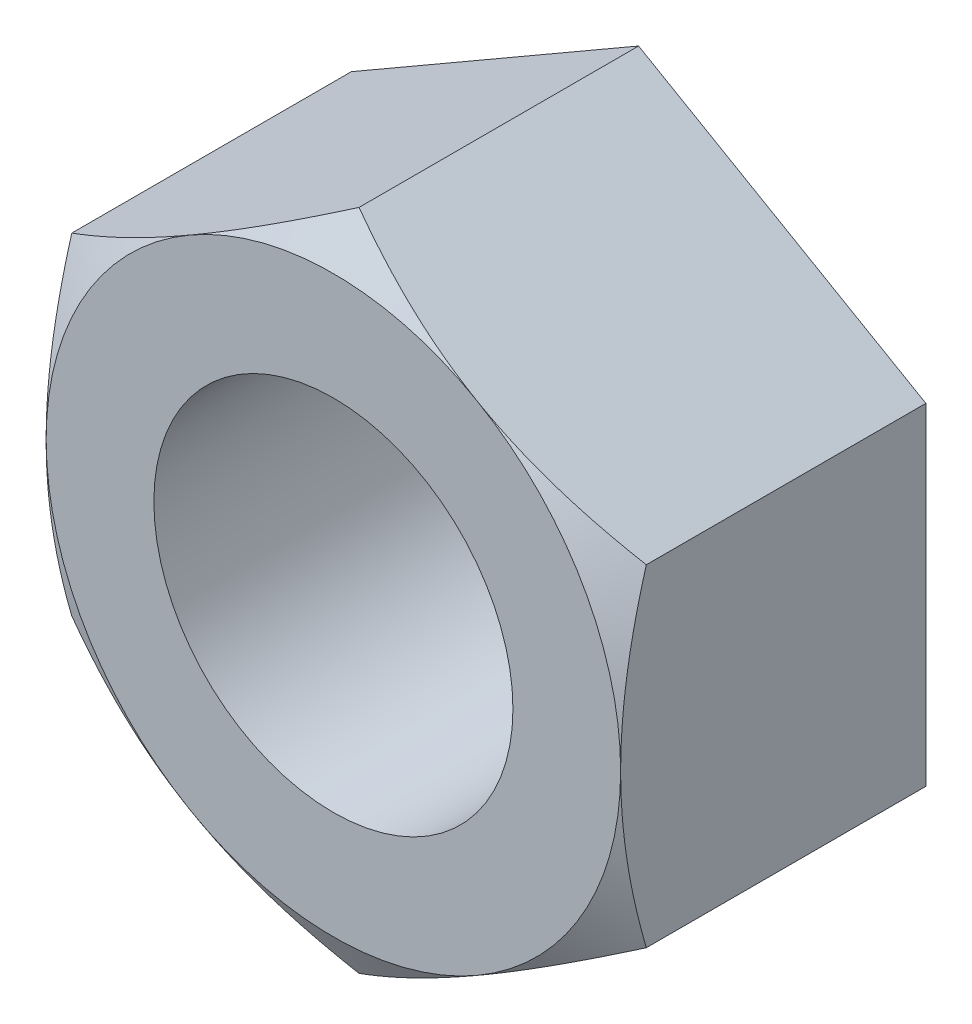
ISO-10303-21;
HEADER;
FILE_DESCRIPTION(('STEP AP214'),'2;1');
FILE_NAME('part.step','',(''),(''),'','','');
FILE_SCHEMA(('AUTOMOTIVE_DESIGN { 1 0 10303 214 1 1 1 1 }'));
ENDSEC;
DATA;
#1=APPLICATION_CONTEXT('core data for automotive mechanical design processes');
#2=APPLICATION_PROTOCOL_DEFINITION('international standard','automotive_design',2000,#1);
#3=PRODUCT_CONTEXT('',#1,'mechanical');
#4=PRODUCT('Part','Part','',(#3));
#5=PRODUCT_RELATED_PRODUCT_CATEGORY('part','',(#4));
#6=PRODUCT_DEFINITION_FORMATION('','',#4);
#7=PRODUCT_DEFINITION_CONTEXT('part definition',#1,'design');
#8=PRODUCT_DEFINITION('design','',#6,#7);
#9=PRODUCT_DEFINITION_SHAPE('','',#8);
#10=(LENGTH_UNIT() NAMED_UNIT(*) SI_UNIT(.MILLI.,.METRE.));
#11=(NAMED_UNIT(*) PLANE_ANGLE_UNIT() SI_UNIT($,.RADIAN.));
#12=(NAMED_UNIT(*) SI_UNIT($,.STERADIAN.) SOLID_ANGLE_UNIT());
#13=UNCERTAINTY_MEASURE_WITH_UNIT(LENGTH_MEASURE(1.E-05),#10,'distance_accuracy_value','');
#14=(GEOMETRIC_REPRESENTATION_CONTEXT(3) GLOBAL_UNCERTAINTY_ASSIGNED_CONTEXT((#13)) GLOBAL_UNIT_ASSIGNED_CONTEXT((#10,
#11,#12)) REPRESENTATION_CONTEXT('',''));
#15=CARTESIAN_POINT('',(0.,0.,0.));
#16=DIRECTION('',(0.,0.,1.));
#17=DIRECTION('',(1.,0.,0.));
#18=AXIS2_PLACEMENT_3D('',#15,#16,#17);
#19=CARTESIAN_POINT('',(-6.35,3.66617420935412,3.3734375));
#20=DIRECTION('',(0.,0.,1.));
#21=DIRECTION('',(1.,0.,0.));
#22=AXIS2_PLACEMENT_3D('',#19,#20,#21);
#23=PLANE('',#22);
#24=CARTESIAN_POINT('',(0.,0.,3.3734375));
#25=DIRECTION('',(0.,0.,1.));
#26=DIRECTION('',(1.,0.,0.));
#27=AXIS2_PLACEMENT_3D('',#24,#25,#26);
#28=CIRCLE('',#27,3.96875);
#29=CARTESIAN_POINT('',(3.96875,0.,3.3734375));
#30=VERTEX_POINT('',#29);
#31=EDGE_CURVE('E257',#30,#30,#28,.T.);
#32=ORIENTED_EDGE('',*,*,#31,.F.);
#33=EDGE_LOOP('',(#32));
#34=FACE_BOUND('',#33,.T.);
#35=CARTESIAN_POINT('',(0.,0.,3.3734375));
#36=DIRECTION('',(0.,0.,1.));
#37=DIRECTION('',(1.,0.,0.));
#38=AXIS2_PLACEMENT_3D('',#35,#36,#37);
#39=CIRCLE('',#38,6.35);
#40=CARTESIAN_POINT('',(3.175,-5.49926131403118,3.3734375));
#41=VERTEX_POINT('',#40);
#42=CARTESIAN_POINT('',(6.35,0.,3.3734375));
#43=VERTEX_POINT('',#42);
#44=EDGE_CURVE('E145',#41,#43,#39,.T.);
#45=ORIENTED_EDGE('',*,*,#44,.T.);
#46=CARTESIAN_POINT('',(3.175,5.49926131403119,3.3734375));
#47=VERTEX_POINT('',#46);
#48=EDGE_CURVE('E143',#43,#47,#39,.T.);
#49=ORIENTED_EDGE('',*,*,#48,.T.);
#50=CARTESIAN_POINT('',(-3.175,5.49926131403119,3.3734375));
#51=VERTEX_POINT('',#50);
#52=EDGE_CURVE('E125',#47,#51,#39,.T.);
#53=ORIENTED_EDGE('',*,*,#52,.T.);
#54=CARTESIAN_POINT('',(-6.35,0.,3.3734375));
#55=VERTEX_POINT('',#54);
#56=EDGE_CURVE('E115',#51,#55,#39,.T.);
#57=ORIENTED_EDGE('',*,*,#56,.T.);
#58=CARTESIAN_POINT('',(-3.175,-5.49926131403118,3.3734375));
#59=VERTEX_POINT('',#58);
#60=EDGE_CURVE('E60',#55,#59,#39,.T.);
#61=ORIENTED_EDGE('',*,*,#60,.T.);
#62=EDGE_CURVE('E68',#59,#41,#39,.T.);
#63=ORIENTED_EDGE('',*,*,#62,.T.);
#64=EDGE_LOOP('',(#45,#49,#53,#57,#61,#63));
#65=FACE_BOUND('',#64,.T.);
#66=ADVANCED_FACE('F38',(#34,#65),#23,.T.);
#67=CARTESIAN_POINT('',(0.,7.33234841870825,3.3734375));
#68=DIRECTION('',(0.5,-0.866025403784438,0.));
#69=DIRECTION('',(0.866025403784439,0.5,0.));
#70=AXIS2_PLACEMENT_3D('',#67,#68,#69);
#71=PLANE('',#70);
#72=CARTESIAN_POINT('',(0.000199999999999903,7.33246388876209,2.80621170777935));
#73=CARTESIAN_POINT('',(-0.13938032578862,7.25187715009445,2.85273170411452));
#74=CARTESIAN_POINT('',(-0.279481074729296,7.17098994497988,2.89714046741413));
#75=CARTESIAN_POINT('',(-0.560820342806735,7.00855864282176,2.98115404954761));
#76=CARTESIAN_POINT('',(-0.70205932495446,6.9270142784587,3.02075679602388));
#77=CARTESIAN_POINT('',(-1.12803769480199,6.68107555195827,3.13157867619013));
#78=CARTESIAN_POINT('',(-1.41445856787971,6.51571038378532,3.19461301779755));
#79=CARTESIAN_POINT('',(-1.84308219577883,6.26824441683674,3.26852842830442));
#80=CARTESIAN_POINT('',(-1.98400426016695,6.18688302502749,3.2895848320668));
#81=CARTESIAN_POINT('',(-2.26648514857209,6.02379260806586,3.32489345533825));
#82=CARTESIAN_POINT('',(-2.40804391521192,5.94206361604021,3.33914627603278));
#83=CARTESIAN_POINT('',(-2.69140731222967,5.77846368249352,3.36048449572192));
#84=CARTESIAN_POINT('',(-2.83321147979293,5.69659300817866,3.36757802897671));
#85=CARTESIAN_POINT('',(-3.11694298566665,5.53278054688489,3.37445317917148));
#86=CARTESIAN_POINT('',(-3.2588703200367,5.45083876218098,3.37423502198908));
#87=CARTESIAN_POINT('',(-3.64770666350069,5.22634399461133,3.36358692347294));
#88=CARTESIAN_POINT('',(-3.89448839447147,5.08386449580427,3.34571085959146));
#89=CARTESIAN_POINT('',(-4.38641274968262,4.79985183690218,3.28902529414257));
#90=CARTESIAN_POINT('',(-4.63155364385826,4.65831967566049,3.25019641713413));
#91=CARTESIAN_POINT('',(-5.12446802425625,4.37373542545027,3.15313532974999));
#92=CARTESIAN_POINT('',(-5.37217931287431,4.23071924628532,3.09449187504068));
#93=CARTESIAN_POINT('',(-5.86390778098996,3.94681968285055,2.96139483128931));
#94=CARTESIAN_POINT('',(-6.10793125807364,3.8059326626677,2.88697250689232));
#95=CARTESIAN_POINT('',(-6.3502,3.66605873930029,2.80621170777935));
#96=B_SPLINE_CURVE_WITH_KNOTS('',3,(#72,#73,#74,#75,#76,#77,#78,#79,#80,#81,#82,#83,#84,#85,#86,
#87,#88,#89,#90,#91,#92,#93,#94,#95),.UNSPECIFIED.,.F.,.F.,(4,2,2,2,2,2,2,2,2,2,2,4),(0.,
0.503218195050233,1.00665261286994,2.01561339063536,2.50773694105499,2.99981699787609,
3.49133733019735,3.9828424781586,4.83850206575152,5.69495425638522,6.57040160519864,
7.44413026658512),.UNSPECIFIED.);
#97=CARTESIAN_POINT('',(0.,7.33234841870825,2.80627837602079));
#98=VERTEX_POINT('',#97);
#99=EDGE_CURVE('E130',#98,#51,#96,.T.);
#100=ORIENTED_EDGE('',*,*,#99,.F.);
#101=DIRECTION('',(0.,0.,-1.));
#102=VECTOR('',#101,1.);
#103=CARTESIAN_POINT('',(0.,7.33234841870825,3.3734375));
#104=LINE('',#103,#102);
#105=CARTESIAN_POINT('',(0.,7.33234841870825,-3.3734375));
#106=VERTEX_POINT('',#105);
#107=EDGE_CURVE('E235',#98,#106,#104,.T.);
#108=ORIENTED_EDGE('',*,*,#107,.T.);
#109=DIRECTION('',(-0.866025403784438,-0.5,0.));
#110=VECTOR('',#109,1.);
#111=CARTESIAN_POINT('',(0.,7.33234841870825,-3.3734375));
#112=LINE('',#111,#110);
#113=CARTESIAN_POINT('',(-6.35,3.66617420935412,-3.3734375));
#114=VERTEX_POINT('',#113);
#115=EDGE_CURVE('E252',#106,#114,#112,.T.);
#116=ORIENTED_EDGE('',*,*,#115,.T.);
#117=DIRECTION('',(0.,0.,-1.));
#118=VECTOR('',#117,1.);
#119=CARTESIAN_POINT('',(-6.35,3.66617420935412,3.3734375));
#120=LINE('',#119,#118);
#121=CARTESIAN_POINT('',(-6.35,3.66617420935412,2.80627837602079));
#122=VERTEX_POINT('',#121);
#123=EDGE_CURVE('E139',#122,#114,#120,.T.);
#124=ORIENTED_EDGE('',*,*,#123,.F.);
#125=EDGE_CURVE('E119',#51,#122,#96,.T.);
#126=ORIENTED_EDGE('',*,*,#125,.F.);
#127=EDGE_LOOP('',(#100,#108,#116,#124,#126));
#128=FACE_BOUND('',#127,.T.);
#129=ADVANCED_FACE('F40',(#128),#71,.F.);
#130=CARTESIAN_POINT('',(-6.35,3.66617420935412,3.3734375));
#131=DIRECTION('',(1.,0.,0.));
#132=DIRECTION('',(0.,1.,0.));
#133=AXIS2_PLACEMENT_3D('',#130,#131,#132);
#134=PLANE('',#133);
#135=CARTESIAN_POINT('',(-6.35,-9.87937994766632,0.259133649749215));
#136=CARTESIAN_POINT('',(-6.35,-9.6016813437822,0.393969074562423));
#137=CARTESIAN_POINT('',(-6.35,-9.32334846221437,0.527520405276466));
#138=CARTESIAN_POINT('',(-6.35,-8.76507679465625,0.791333006651896));
#139=CARTESIAN_POINT('',(-6.35,-8.48513776645437,0.921593764181887));
#140=CARTESIAN_POINT('',(-6.35,-7.92189027647534,1.17875144918255));
#141=CARTESIAN_POINT('',(-6.35,-7.63857178853165,1.30562649179081));
#142=CARTESIAN_POINT('',(-6.35,-7.06969138639715,1.55422371771104));
#143=CARTESIAN_POINT('',(-6.35,-6.78412957824153,1.67594614285536));
#144=CARTESIAN_POINT('',(-6.35,-6.20114886274533,1.9166601926086));
#145=CARTESIAN_POINT('',(-6.35,-5.90364234283374,2.03544077547391));
#146=CARTESIAN_POINT('',(-6.35,-5.30516064161939,2.26408830004696));
#147=CARTESIAN_POINT('',(-6.35,-5.0041850773743,2.37395424670853));
#148=CARTESIAN_POINT('',(-6.35,-4.39883988696204,2.58191309613654));
#149=CARTESIAN_POINT('',(-6.35,-4.09447841851917,2.68002951285766));
#150=CARTESIAN_POINT('',(-6.35,-3.48138743204235,2.86136156298498));
#151=CARTESIAN_POINT('',(-6.35,-3.17265931144259,2.9445818520804));
#152=CARTESIAN_POINT('',(-6.35,-2.55230340352441,3.0917317456567));
#153=CARTESIAN_POINT('',(-6.35,-2.24069979942473,3.15576167850948));
#154=CARTESIAN_POINT('',(-6.35,-1.61354245575545,3.26088638422217));
#155=CARTESIAN_POINT('',(-6.35,-1.29798913096261,3.30198354502797));
#156=CARTESIAN_POINT('',(-6.35,-0.825051342226879,3.3437025381616));
#157=CARTESIAN_POINT('',(-6.35,-0.66850649474285,3.35428197066734));
#158=CARTESIAN_POINT('',(-6.35,-0.355102709009022,3.36881529811816));
#159=CARTESIAN_POINT('',(-6.35,-0.198243776072386,3.37276930420857));
#160=CARTESIAN_POINT('',(-6.35,0.115501600780629,3.37395007955799));
#161=CARTESIAN_POINT('',(-6.35,0.272388045155726,3.37117672329165));
#162=CARTESIAN_POINT('',(-6.35,0.585904199016652,3.35897270442308));
#163=CARTESIAN_POINT('',(-6.35,0.742533895527218,3.34954171516521));
#164=CARTESIAN_POINT('',(-6.35,1.11786349572806,3.31916515303489));
#165=CARTESIAN_POINT('',(-6.35,1.33631800980229,3.2951219071515));
#166=CARTESIAN_POINT('',(-6.35,1.77161738104428,3.23538721975078));
#167=CARTESIAN_POINT('',(-6.35,1.98846202061493,3.1996942319024));
#168=CARTESIAN_POINT('',(-6.35,2.63631316237945,3.07703273593172));
#169=CARTESIAN_POINT('',(-6.35,3.06441280383803,2.97450223969811));
#170=CARTESIAN_POINT('',(-6.35,3.70486769341451,2.79648456197033));
#171=CARTESIAN_POINT('',(-6.35,3.92053439300226,2.73222537807502));
#172=CARTESIAN_POINT('',(-6.35,4.34977195545168,2.59698914356091));
#173=CARTESIAN_POINT('',(-6.35,4.56334280192721,2.52601204046514));
#174=CARTESIAN_POINT('',(-6.35,4.98845984799511,2.3784827924437));
#175=CARTESIAN_POINT('',(-6.35,5.2000066411756,2.30193234246527));
#176=CARTESIAN_POINT('',(-6.35,5.62133991046998,2.14416176149556));
#177=CARTESIAN_POINT('',(-6.35,5.83112643112681,2.0629417490764));
#178=CARTESIAN_POINT('',(-6.35,6.41597630421686,1.83023401849559));
#179=CARTESIAN_POINT('',(-6.35,6.7893102976825,1.67440348463183));
#180=CARTESIAN_POINT('',(-6.35,7.53202844857044,1.35356444714377));
#181=CARTESIAN_POINT('',(-6.35,7.90141212119592,1.18855483209795));
#182=CARTESIAN_POINT('',(-6.35,8.63718975653995,0.851629974837483));
#183=CARTESIAN_POINT('',(-6.35,9.00358242629375,0.67971191858923));
#184=CARTESIAN_POINT('',(-6.35,9.73386291865289,0.330695460273695));
#185=CARTESIAN_POINT('',(-6.35,10.0977508538453,0.15359729295424));
#186=CARTESIAN_POINT('',(-6.35,10.8241492822828,-0.204907071329098));
#187=CARTESIAN_POINT('',(-6.35,11.1866564646212,-0.386319962673162));
#188=CARTESIAN_POINT('',(-6.35,11.9100730248236,-0.752307026488238));
#189=CARTESIAN_POINT('',(-6.35,12.2709823876911,-0.936881228551023));
#190=CARTESIAN_POINT('',(-6.35,12.9914141371351,-1.30850538546207));
#191=CARTESIAN_POINT('',(-6.35,13.3509368328442,-1.49555474173249));
#192=CARTESIAN_POINT('',(-6.35,14.0689136505722,-1.87169426746676));
#193=CARTESIAN_POINT('',(-6.35,14.427367768605,-2.06078444453158));
#194=CARTESIAN_POINT('',(-6.35,15.4216610454223,-2.58824372846845));
#195=CARTESIAN_POINT('',(-6.35,16.0565483517511,-2.92840669694288));
#196=CARTESIAN_POINT('',(-6.35,17.3243254082696,-3.61252776453465));
#197=CARTESIAN_POINT('',(-6.35,17.9572150219643,-3.95648611605414));
#198=CARTESIAN_POINT('',(-6.35,19.2193191369516,-4.64603564263518));
#199=CARTESIAN_POINT('',(-6.35,19.8485388243479,-4.99161733415419));
#200=CARTESIAN_POINT('',(-6.35,21.105733766491,-5.6849157714166));
#201=CARTESIAN_POINT('',(-6.35,21.7337091194162,-6.03263233905913));
#202=CARTESIAN_POINT('',(-6.35,22.3612531285499,-6.38112028110352));
#203=B_SPLINE_CURVE_WITH_KNOTS('',3,(#135,#136,#137,#138,#139,#140,#141,#142,#143,#144,#145,
#146,#147,#148,#149,#150,#151,#152,#153,#154,#155,#156,#157,#158,#159,#160,#161,#162,#163,#164,
#165,#166,#167,#168,#169,#170,#171,#172,#173,#174,#175,#176,#177,#178,#179,#180,#181,#182,#183,
#184,#185,#186,#187,#188,#189,#190,#191,#192,#193,#194,#195,#196,#197,#198,#199,#200,#201,#202),
.UNSPECIFIED.,.F.,.F.,(4,2,2,2,2,2,2,2,2,2,2,2,2,2,2,2,2,2,2,2,2,2,2,2,2,2,2,2,2,2,2,2,2,4),(0.,
0.92611806511166,1.85237966838102,2.78362788972569,3.71483235540579,4.67574785427018,
5.63677046280392,6.59583647477302,7.55460221141565,8.50826433131535,9.46182712965449,
9.93241400488063,10.4029929856626,10.8735807470103,11.3441915992724,12.0031414207205,
12.662178743612,13.9809254283547,14.655977250816,15.3310343468743,16.0058869975737,
16.6807225196021,17.8941857289737,19.1077961880729,20.321906103354,21.5359610836277,
22.7520415366091,23.9681333790639,25.1839363164889,26.3997437836875,28.5605417206697,
30.7214842325089,32.875103620081,35.0285457203998),.UNSPECIFIED.);
#204=EDGE_CURVE('E121',#122,#55,#203,.F.);
#205=ORIENTED_EDGE('',*,*,#204,.F.);
#206=ORIENTED_EDGE('',*,*,#123,.T.);
#207=DIRECTION('',(0.,-1.,0.));
#208=VECTOR('',#207,1.);
#209=CARTESIAN_POINT('',(-6.35,3.66617420935412,-3.3734375));
#210=LINE('',#209,#208);
#211=CARTESIAN_POINT('',(-6.35,-3.66617420935412,-3.3734375));
#212=VERTEX_POINT('',#211);
#213=EDGE_CURVE('E248',#114,#212,#210,.T.);
#214=ORIENTED_EDGE('',*,*,#213,.T.);
#215=DIRECTION('',(0.,0.,-1.));
#216=VECTOR('',#215,1.);
#217=CARTESIAN_POINT('',(-6.35,-3.66617420935412,3.3734375));
#218=LINE('',#217,#216);
#219=CARTESIAN_POINT('',(-6.35,-3.66617420935412,2.80627837602079));
#220=VERTEX_POINT('',#219);
#221=EDGE_CURVE('E244',#220,#212,#218,.T.);
#222=ORIENTED_EDGE('',*,*,#221,.F.);
#223=EDGE_CURVE('E188',#55,#220,#203,.F.);
#224=ORIENTED_EDGE('',*,*,#223,.F.);
#225=EDGE_LOOP('',(#205,#206,#214,#222,#224));
#226=FACE_BOUND('',#225,.T.);
#227=ADVANCED_FACE('F197',(#226),#134,.F.);
#228=CARTESIAN_POINT('',(-6.35,-3.66617420935412,3.3734375));
#229=DIRECTION('',(0.5,0.866025403784439,0.));
#230=DIRECTION('',(-0.866025403784439,0.5,0.));
#231=AXIS2_PLACEMENT_3D('',#228,#229,#230);
#232=PLANE('',#231);
#233=CARTESIAN_POINT('',(-6.3502,-3.66605873930029,2.80621170777935));
#234=CARTESIAN_POINT('',(-6.21061967421138,-3.74664547796792,2.85273170411452));
#235=CARTESIAN_POINT('',(-6.0705189252707,-3.82753268308249,2.89714046741414));
#236=CARTESIAN_POINT('',(-5.78917965719326,-3.98996398524061,2.98115404954761));
#237=CARTESIAN_POINT('',(-5.64794067504554,-4.07150834960367,3.02075679602388));
#238=CARTESIAN_POINT('',(-5.22196230519801,-4.3174470761041,3.13157867619013));
#239=CARTESIAN_POINT('',(-4.93554143212029,-4.48281224427705,3.19461301779756));
#240=CARTESIAN_POINT('',(-4.50691780422117,-4.73027821122564,3.26852842830443));
#241=CARTESIAN_POINT('',(-4.36599573983304,-4.81163960303488,3.2895848320668));
#242=CARTESIAN_POINT('',(-4.08351485142791,-4.97473001999651,3.32489345533825));
#243=CARTESIAN_POINT('',(-3.94195608478808,-5.05645901202217,3.33914627603278));
#244=CARTESIAN_POINT('',(-3.65859268777033,-5.22005894556885,3.36048449572192));
#245=CARTESIAN_POINT('',(-3.51678852020707,-5.30192961988371,3.36757802897671));
#246=CARTESIAN_POINT('',(-3.23305701433335,-5.46574208117748,3.37445317917148));
#247=CARTESIAN_POINT('',(-3.09112967996329,-5.5476838658814,3.37423502198908));
#248=CARTESIAN_POINT('',(-2.7022933364993,-5.77217863345104,3.36358692347294));
#249=CARTESIAN_POINT('',(-2.45551160552853,-5.9146581322581,3.34571085959146));
#250=CARTESIAN_POINT('',(-1.96358725031738,-6.19867079116019,3.28902529414257));
#251=CARTESIAN_POINT('',(-1.71844635614174,-6.34020295240188,3.25019641713413));
#252=CARTESIAN_POINT('',(-1.22553197574375,-6.6247872026121,3.15313532974999));
#253=CARTESIAN_POINT('',(-0.977820687125689,-6.76780338177705,3.09449187504068));
#254=CARTESIAN_POINT('',(-0.486092219010038,-7.05170294521182,2.96139483128932));
#255=CARTESIAN_POINT('',(-0.242068741926361,-7.19258996539467,2.88697250689232));
#256=CARTESIAN_POINT('',(0.000199999999994781,-7.33246388876208,2.80621170777935));
#257=B_SPLINE_CURVE_WITH_KNOTS('',3,(#233,#234,#235,#236,#237,#238,#239,#240,#241,#242,#243,
#244,#245,#246,#247,#248,#249,#250,#251,#252,#253,#254,#255,#256),.UNSPECIFIED.,.F.,.F.,(4,2,2,
2,2,2,2,2,2,2,2,4),(0.,0.503218195050232,1.00665261286994,2.01561339063536,2.50773694105499,
2.99981699787608,3.49133733019735,3.9828424781586,4.83850206575152,5.69495425638522,
6.57040160519863,7.44413026658512),.UNSPECIFIED.);
#258=EDGE_CURVE('E186',#220,#59,#257,.T.);
#259=ORIENTED_EDGE('',*,*,#258,.F.);
#260=ORIENTED_EDGE('',*,*,#221,.T.);
#261=DIRECTION('',(0.866025403784439,-0.5,0.));
#262=VECTOR('',#261,1.);
#263=CARTESIAN_POINT('',(-6.35,-3.66617420935412,-3.3734375));
#264=LINE('',#263,#262);
#265=CARTESIAN_POINT('',(0.,-7.33234841870824,-3.3734375));
#266=VERTEX_POINT('',#265);
#267=EDGE_CURVE('E255',#212,#266,#264,.T.);
#268=ORIENTED_EDGE('',*,*,#267,.T.);
#269=DIRECTION('',(0.,0.,-1.));
#270=VECTOR('',#269,1.);
#271=CARTESIAN_POINT('',(0.,-7.33234841870824,3.3734375));
#272=LINE('',#271,#270);
#273=CARTESIAN_POINT('',(0.,-7.33234841870824,2.80627837602079));
#274=VERTEX_POINT('',#273);
#275=EDGE_CURVE('E237',#274,#266,#272,.T.);
#276=ORIENTED_EDGE('',*,*,#275,.F.);
#277=EDGE_CURVE('E180',#59,#274,#257,.T.);
#278=ORIENTED_EDGE('',*,*,#277,.F.);
#279=EDGE_LOOP('',(#259,#260,#268,#276,#278));
#280=FACE_BOUND('',#279,.T.);
#281=ADVANCED_FACE('F193',(#280),#232,.F.);
#282=CARTESIAN_POINT('',(0.,-7.33234841870824,3.3734375));
#283=DIRECTION('',(-0.5,0.866025403784438,0.));
#284=DIRECTION('',(-0.866025403784438,-0.5,0.));
#285=AXIS2_PLACEMENT_3D('',#282,#283,#284);
#286=PLANE('',#285);
#287=CARTESIAN_POINT('',(-0.00020000000000424,-7.33246388876208,2.80621170777935));
#288=CARTESIAN_POINT('',(0.139380325788616,-7.25187715009445,2.85273170411452));
#289=CARTESIAN_POINT('',(0.279481074729291,-7.17098994497988,2.89714046741414));
#290=CARTESIAN_POINT('',(0.560820342806731,-7.00855864282176,2.98115404954761));
#291=CARTESIAN_POINT('',(0.702059324954456,-6.9270142784587,3.02075679602389));
#292=CARTESIAN_POINT('',(1.12803769480199,-6.68107555195827,3.13157867619013));
#293=CARTESIAN_POINT('',(1.41445856787971,-6.51571038378532,3.19461301779756));
#294=CARTESIAN_POINT('',(1.84308219577882,-6.26824441683673,3.26852842830443));
#295=CARTESIAN_POINT('',(1.98400426016695,-6.18688302502749,3.2895848320668));
#296=CARTESIAN_POINT('',(2.26648514857209,-6.02379260806586,3.32489345533825));
#297=CARTESIAN_POINT('',(2.40804391521191,-5.9420636160402,3.33914627603278));
#298=CARTESIAN_POINT('',(2.69140731222966,-5.77846368249352,3.36048449572192));
#299=CARTESIAN_POINT('',(2.83321147979292,-5.69659300817866,3.36757802897671));
#300=CARTESIAN_POINT('',(3.11694298566664,-5.53278054688489,3.37445317917148));
#301=CARTESIAN_POINT('',(3.2588703200367,-5.45083876218097,3.37423502198908));
#302=CARTESIAN_POINT('',(3.64770666350069,-5.22634399461133,3.36358692347295));
#303=CARTESIAN_POINT('',(3.89448839447146,-5.08386449580427,3.34571085959147));
#304=CARTESIAN_POINT('',(4.38641274968262,-4.79985183690217,3.28902529414257));
#305=CARTESIAN_POINT('',(4.63155364385826,-4.65831967566048,3.25019641713413));
#306=CARTESIAN_POINT('',(5.12446802425625,-4.37373542545026,3.15313532974999));
#307=CARTESIAN_POINT('',(5.37217931287431,-4.23071924628532,3.09449187504068));
#308=CARTESIAN_POINT('',(5.86390778098996,-3.94681968285054,2.96139483128932));
#309=CARTESIAN_POINT('',(6.10793125807364,-3.80593266266769,2.88697250689232));
#310=CARTESIAN_POINT('',(6.3502,-3.66605873930028,2.80621170777935));
#311=B_SPLINE_CURVE_WITH_KNOTS('',3,(#287,#288,#289,#290,#291,#292,#293,#294,#295,#296,#297,
#298,#299,#300,#301,#302,#303,#304,#305,#306,#307,#308,#309,#310),.UNSPECIFIED.,.F.,.F.,(4,2,2,
2,2,2,2,2,2,2,2,4),(0.,0.503218195050232,1.00665261286994,2.01561339063536,2.50773694105499,
2.99981699787608,3.49133733019735,3.9828424781586,4.83850206575152,5.69495425638523,
6.57040160519864,7.44413026658513),.UNSPECIFIED.);
#312=EDGE_CURVE('E187',#274,#41,#311,.T.);
#313=ORIENTED_EDGE('',*,*,#312,.F.);
#314=ORIENTED_EDGE('',*,*,#275,.T.);
#315=DIRECTION('',(0.866025403784439,0.5,0.));
#316=VECTOR('',#315,1.);
#317=CARTESIAN_POINT('',(0.,-7.33234841870824,-3.3734375));
#318=LINE('',#317,#316);
#319=CARTESIAN_POINT('',(6.35,-3.66617420935412,-3.3734375));
#320=VERTEX_POINT('',#319);
#321=EDGE_CURVE('E263',#266,#320,#318,.T.);
#322=ORIENTED_EDGE('',*,*,#321,.T.);
#323=DIRECTION('',(0.,0.,-1.));
#324=VECTOR('',#323,1.);
#325=CARTESIAN_POINT('',(6.35,-3.66617420935412,3.3734375));
#326=LINE('',#325,#324);
#327=CARTESIAN_POINT('',(6.35,-3.66617420935412,2.8062783760208));
#328=VERTEX_POINT('',#327);
#329=EDGE_CURVE('E234',#328,#320,#326,.T.);
#330=ORIENTED_EDGE('',*,*,#329,.F.);
#331=EDGE_CURVE('E154',#41,#328,#311,.T.);
#332=ORIENTED_EDGE('',*,*,#331,.F.);
#333=EDGE_LOOP('',(#313,#314,#322,#330,#332));
#334=FACE_BOUND('',#333,.T.);
#335=ADVANCED_FACE('F196',(#334),#286,.F.);
#336=CARTESIAN_POINT('',(6.35,-3.66617420935412,3.3734375));
#337=DIRECTION('',(-1.,0.,0.));
#338=DIRECTION('',(0.,-1.,0.));
#339=AXIS2_PLACEMENT_3D('',#336,#337,#338);
#340=PLANE('',#339);
#341=CARTESIAN_POINT('',(6.35,-9.87937994766631,0.259133649749217));
#342=CARTESIAN_POINT('',(6.35,-9.60168134378219,0.393969074562425));
#343=CARTESIAN_POINT('',(6.35,-9.32334846221436,0.527520405276469));
#344=CARTESIAN_POINT('',(6.35,-8.76507679465624,0.791333006651898));
#345=CARTESIAN_POINT('',(6.35,-8.48513776645436,0.921593764181889));
#346=CARTESIAN_POINT('',(6.35,-7.92189027647534,1.17875144918256));
#347=CARTESIAN_POINT('',(6.35,-7.63857178853165,1.30562649179081));
#348=CARTESIAN_POINT('',(6.35,-7.06969138639714,1.55422371771104));
#349=CARTESIAN_POINT('',(6.35,-6.78412957824152,1.67594614285536));
#350=CARTESIAN_POINT('',(6.35,-6.20114886274532,1.9166601926086));
#351=CARTESIAN_POINT('',(6.35,-5.90364234283373,2.03544077547391));
#352=CARTESIAN_POINT('',(6.35,-5.30516064161938,2.26408830004696));
#353=CARTESIAN_POINT('',(6.35,-5.0041850773743,2.37395424670853));
#354=CARTESIAN_POINT('',(6.35,-4.39883988696203,2.58191309613654));
#355=CARTESIAN_POINT('',(6.35,-4.09447841851916,2.68002951285766));
#356=CARTESIAN_POINT('',(6.35,-3.48138743204234,2.86136156298498));
#357=CARTESIAN_POINT('',(6.35,-3.17265931144258,2.9445818520804));
#358=CARTESIAN_POINT('',(6.35,-2.5523034035244,3.0917317456567));
#359=CARTESIAN_POINT('',(6.35,-2.24069979942472,3.15576167850948));
#360=CARTESIAN_POINT('',(6.35,-1.61354245575545,3.26088638422217));
#361=CARTESIAN_POINT('',(6.35,-1.2979891309626,3.30198354502797));
#362=CARTESIAN_POINT('',(6.35,-0.825051342226873,3.34370253816161));
#363=CARTESIAN_POINT('',(6.35,-0.668506494742843,3.35428197066735));
#364=CARTESIAN_POINT('',(6.35,-0.355102709009016,3.36881529811816));
#365=CARTESIAN_POINT('',(6.35,-0.19824377607238,3.37276930420857));
#366=CARTESIAN_POINT('',(6.35,0.115501600780635,3.37395007955799));
#367=CARTESIAN_POINT('',(6.35,0.272388045155732,3.37117672329165));
#368=CARTESIAN_POINT('',(6.35,0.585904199016658,3.35897270442308));
#369=CARTESIAN_POINT('',(6.35,0.742533895527224,3.34954171516521));
#370=CARTESIAN_POINT('',(6.35,1.11786349572807,3.31916515303489));
#371=CARTESIAN_POINT('',(6.34999999999999,1.33631800980229,3.29512190715151));
#372=CARTESIAN_POINT('',(6.34999999999999,1.77161738104429,3.23538721975078));
#373=CARTESIAN_POINT('',(6.34999999999999,1.98846202061494,3.1996942319024));
#374=CARTESIAN_POINT('',(6.34999999999999,2.63631316237945,3.07703273593172));
#375=CARTESIAN_POINT('',(6.34999999999999,3.06441280383803,2.97450223969811));
#376=CARTESIAN_POINT('',(6.34999999999999,3.70486769341451,2.79648456197033));
#377=CARTESIAN_POINT('',(6.34999999999999,3.92053439300227,2.73222537807502));
#378=CARTESIAN_POINT('',(6.34999999999999,4.34977195545168,2.59698914356091));
#379=CARTESIAN_POINT('',(6.34999999999999,4.56334280192721,2.52601204046514));
#380=CARTESIAN_POINT('',(6.34999999999999,4.98845984799511,2.37848279244371));
#381=CARTESIAN_POINT('',(6.34999999999999,5.2000066411756,2.30193234246527));
#382=CARTESIAN_POINT('',(6.34999999999999,5.62133991046998,2.14416176149556));
#383=CARTESIAN_POINT('',(6.34999999999999,5.83112643112682,2.0629417490764));
#384=CARTESIAN_POINT('',(6.34999999999999,6.41597630421687,1.83023401849559));
#385=CARTESIAN_POINT('',(6.34999999999999,6.7893102976825,1.67440348463183));
#386=CARTESIAN_POINT('',(6.34999999999999,7.53202844857044,1.35356444714377));
#387=CARTESIAN_POINT('',(6.34999999999999,7.90141212119592,1.18855483209795));
#388=CARTESIAN_POINT('',(6.34999999999999,8.63718975653996,0.851629974837483));
#389=CARTESIAN_POINT('',(6.34999999999999,9.00358242629376,0.67971191858923));
#390=CARTESIAN_POINT('',(6.34999999999999,9.7338629186529,0.330695460273695));
#391=CARTESIAN_POINT('',(6.34999999999999,10.0977508538453,0.15359729295424));
#392=CARTESIAN_POINT('',(6.34999999999999,10.8241492822828,-0.204907071329099));
#393=CARTESIAN_POINT('',(6.34999999999999,11.1866564646213,-0.386319962673163));
#394=CARTESIAN_POINT('',(6.34999999999999,11.9100730248236,-0.75230702648824));
#395=CARTESIAN_POINT('',(6.34999999999999,12.2709823876911,-0.936881228551026));
#396=CARTESIAN_POINT('',(6.34999999999999,12.9914141371351,-1.30850538546207));
#397=CARTESIAN_POINT('',(6.34999999999999,13.3509368328442,-1.49555474173249));
#398=CARTESIAN_POINT('',(6.34999999999999,14.0689136505723,-1.87169426746677));
#399=CARTESIAN_POINT('',(6.34999999999999,14.427367768605,-2.06078444453159));
#400=CARTESIAN_POINT('',(6.34999999999999,15.4216610454223,-2.58824372846846));
#401=CARTESIAN_POINT('',(6.34999999999999,16.0565483517512,-2.92840669694288));
#402=CARTESIAN_POINT('',(6.34999999999999,17.3243254082696,-3.61252776453466));
#403=CARTESIAN_POINT('',(6.34999999999999,17.9572150219643,-3.95648611605414));
#404=CARTESIAN_POINT('',(6.34999999999999,19.2193191369517,-4.64603564263519));
#405=CARTESIAN_POINT('',(6.34999999999998,19.8485388243479,-4.99161733415419));
#406=CARTESIAN_POINT('',(6.34999999999998,21.105733766491,-5.68491577141659));
#407=CARTESIAN_POINT('',(6.34999999999998,21.7337091194162,-6.03263233905913));
#408=CARTESIAN_POINT('',(6.34999999999998,22.3612531285499,-6.38112028110351));
#409=B_SPLINE_CURVE_WITH_KNOTS('',3,(#341,#342,#343,#344,#345,#346,#347,#348,#349,#350,#351,
#352,#353,#354,#355,#356,#357,#358,#359,#360,#361,#362,#363,#364,#365,#366,#367,#368,#369,#370,
#371,#372,#373,#374,#375,#376,#377,#378,#379,#380,#381,#382,#383,#384,#385,#386,#387,#388,#389,
#390,#391,#392,#393,#394,#395,#396,#397,#398,#399,#400,#401,#402,#403,#404,#405,#406,#407,#408),
.UNSPECIFIED.,.F.,.F.,(4,2,2,2,2,2,2,2,2,2,2,2,2,2,2,2,2,2,2,2,2,2,2,2,2,2,2,2,2,2,2,2,2,4),(0.,
0.926118065111659,1.85237966838101,2.78362788972569,3.71483235540579,4.67574785427018,
5.63677046280392,6.59583647477302,7.55460221141565,8.50826433131535,9.46182712965449,
9.93241400488063,10.4029929856626,10.8735807470103,11.3441915992724,12.0031414207205,
12.662178743612,13.9809254283547,14.655977250816,15.3310343468743,16.0058869975737,
16.6807225196021,17.8941857289737,19.1077961880729,20.321906103354,21.5359610836277,
22.7520415366091,23.9681333790639,25.1839363164889,26.3997437836875,28.5605417206697,
30.7214842325089,32.875103620081,35.0285457203998),.UNSPECIFIED.);
#410=EDGE_CURVE('E153',#328,#43,#409,.T.);
#411=ORIENTED_EDGE('',*,*,#410,.F.);
#412=ORIENTED_EDGE('',*,*,#329,.T.);
#413=DIRECTION('',(0.,1.,0.));
#414=VECTOR('',#413,1.);
#415=CARTESIAN_POINT('',(6.35,-3.66617420935412,-3.3734375));
#416=LINE('',#415,#414);
#417=CARTESIAN_POINT('',(6.34999999999999,3.66617420935413,-3.3734375));
#418=VERTEX_POINT('',#417);
#419=EDGE_CURVE('E232',#320,#418,#416,.T.);
#420=ORIENTED_EDGE('',*,*,#419,.T.);
#421=DIRECTION('',(0.,0.,-1.));
#422=VECTOR('',#421,1.);
#423=CARTESIAN_POINT('',(6.34999999999999,3.66617420935413,3.3734375));
#424=LINE('',#423,#422);
#425=CARTESIAN_POINT('',(6.34999999999999,3.66617420935413,2.80627837602079));
#426=VERTEX_POINT('',#425);
#427=EDGE_CURVE('E226',#426,#418,#424,.T.);
#428=ORIENTED_EDGE('',*,*,#427,.F.);
#429=EDGE_CURVE('E144',#43,#426,#409,.T.);
#430=ORIENTED_EDGE('',*,*,#429,.F.);
#431=EDGE_LOOP('',(#411,#412,#420,#428,#430));
#432=FACE_BOUND('',#431,.T.);
#433=ADVANCED_FACE('F161',(#432),#340,.F.);
#434=CARTESIAN_POINT('',(6.34999999999999,3.66617420935413,3.3734375));
#435=DIRECTION('',(-0.5,-0.866025403784439,0.));
#436=DIRECTION('',(0.866025403784439,-0.5,0.));
#437=AXIS2_PLACEMENT_3D('',#434,#435,#436);
#438=PLANE('',#437);
#439=CARTESIAN_POINT('',(6.35019999999999,3.66605873930029,2.80621170777935));
#440=CARTESIAN_POINT('',(6.21061967421137,3.74664547796793,2.85273170411452));
#441=CARTESIAN_POINT('',(6.0705189252707,3.82753268308249,2.89714046741414));
#442=CARTESIAN_POINT('',(5.78917965719326,3.98996398524062,2.98115404954761));
#443=CARTESIAN_POINT('',(5.64794067504553,4.07150834960367,3.02075679602388));
#444=CARTESIAN_POINT('',(5.221962305198,4.3174470761041,3.13157867619013));
#445=CARTESIAN_POINT('',(4.93554143212028,4.48281224427705,3.19461301779755));
#446=CARTESIAN_POINT('',(4.50691780422117,4.73027821122564,3.26852842830443));
#447=CARTESIAN_POINT('',(4.36599573983304,4.81163960303489,3.2895848320668));
#448=CARTESIAN_POINT('',(4.0835148514279,4.97473001999652,3.32489345533825));
#449=CARTESIAN_POINT('',(3.94195608478808,5.05645901202217,3.33914627603278));
#450=CARTESIAN_POINT('',(3.65859268777033,5.22005894556885,3.36048449572192));
#451=CARTESIAN_POINT('',(3.51678852020706,5.30192961988372,3.36757802897671));
#452=CARTESIAN_POINT('',(3.23305701433334,5.46574208117748,3.37445317917148));
#453=CARTESIAN_POINT('',(3.09112967996329,5.5476838658814,3.37423502198908));
#454=CARTESIAN_POINT('',(2.7022933364993,5.77217863345105,3.36358692347294));
#455=CARTESIAN_POINT('',(2.45551160552853,5.9146581322581,3.34571085959146));
#456=CARTESIAN_POINT('',(1.96358725031737,6.1986707911602,3.28902529414257));
#457=CARTESIAN_POINT('',(1.71844635614173,6.34020295240189,3.25019641713413));
#458=CARTESIAN_POINT('',(1.22553197574374,6.62478720261211,3.15313532974999));
#459=CARTESIAN_POINT('',(0.977820687125683,6.76780338177705,3.09449187504068));
#460=CARTESIAN_POINT('',(0.486092219010032,7.05170294521182,2.96139483128931));
#461=CARTESIAN_POINT('',(0.242068741926355,7.19258996539467,2.88697250689232));
#462=CARTESIAN_POINT('',(-0.000200000000000462,7.33246388876209,2.80621170777935));
#463=B_SPLINE_CURVE_WITH_KNOTS('',3,(#439,#440,#441,#442,#443,#444,#445,#446,#447,#448,#449,
#450,#451,#452,#453,#454,#455,#456,#457,#458,#459,#460,#461,#462),.UNSPECIFIED.,.F.,.F.,(4,2,2,
2,2,2,2,2,2,2,2,4),(0.,0.503218195050233,1.00665261286994,2.01561339063536,2.50773694105499,
2.99981699787608,3.49133733019735,3.9828424781586,4.83850206575152,5.69495425638522,
6.57040160519864,7.44413026658512),.UNSPECIFIED.);
#464=EDGE_CURVE('E12',#426,#47,#463,.T.);
#465=ORIENTED_EDGE('',*,*,#464,.F.);
#466=ORIENTED_EDGE('',*,*,#427,.T.);
#467=DIRECTION('',(-0.866025403784439,0.5,0.));
#468=VECTOR('',#467,1.);
#469=CARTESIAN_POINT('',(6.34999999999999,3.66617420935413,-3.3734375));
#470=LINE('',#469,#468);
#471=EDGE_CURVE('E239',#418,#106,#470,.T.);
#472=ORIENTED_EDGE('',*,*,#471,.T.);
#473=ORIENTED_EDGE('',*,*,#107,.F.);
#474=EDGE_CURVE('E43',#47,#98,#463,.T.);
#475=ORIENTED_EDGE('',*,*,#474,.F.);
#476=EDGE_LOOP('',(#465,#466,#472,#473,#475));
#477=FACE_BOUND('',#476,.T.);
#478=ADVANCED_FACE('F214',(#477),#438,.F.);
#479=CARTESIAN_POINT('',(-6.35,3.66617420935412,-3.3734375));
#480=DIRECTION('',(0.,0.,1.));
#481=DIRECTION('',(1.,0.,0.));
#482=AXIS2_PLACEMENT_3D('',#479,#480,#481);
#483=PLANE('',#482);
#484=ORIENTED_EDGE('',*,*,#115,.F.);
#485=ORIENTED_EDGE('',*,*,#471,.F.);
#486=ORIENTED_EDGE('',*,*,#419,.F.);
#487=ORIENTED_EDGE('',*,*,#321,.F.);
#488=ORIENTED_EDGE('',*,*,#267,.F.);
#489=ORIENTED_EDGE('',*,*,#213,.F.);
#490=EDGE_LOOP('',(#484,#485,#486,#487,#488,#489));
#491=FACE_BOUND('',#490,.T.);
#492=CARTESIAN_POINT('',(0.,0.,-3.3734375));
#493=DIRECTION('',(0.,0.,1.));
#494=DIRECTION('',(1.,0.,0.));
#495=AXIS2_PLACEMENT_3D('',#492,#493,#494);
#496=CIRCLE('',#495,3.96875);
#497=CARTESIAN_POINT('',(3.96875,0.,-3.3734375));
#498=VERTEX_POINT('',#497);
#499=EDGE_CURVE('E135',#498,#498,#496,.T.);
#500=ORIENTED_EDGE('',*,*,#499,.T.);
#501=EDGE_LOOP('',(#500));
#502=FACE_BOUND('',#501,.T.);
#503=ADVANCED_FACE('F212',(#491,#502),#483,.F.);
#504=CARTESIAN_POINT('',(0.,0.,3.3734375));
#505=DIRECTION('',(0.,0.,-1.));
#506=DIRECTION('',(-1.,0.,0.));
#507=AXIS2_PLACEMENT_3D('',#504,#505,#506);
#508=CYLINDRICAL_SURFACE('',#507,3.96875);
#509=ORIENTED_EDGE('',*,*,#31,.T.);
#510=EDGE_LOOP('',(#509));
#511=FACE_BOUND('',#510,.T.);
#512=ORIENTED_EDGE('',*,*,#499,.F.);
#513=EDGE_LOOP('',(#512));
#514=FACE_BOUND('',#513,.T.);
#515=ADVANCED_FACE('F167',(#511,#514),#508,.F.);
#516=CARTESIAN_POINT('',(0.,0.,3.3734375));
#517=DIRECTION('',(0.,0.,-1.));
#518=DIRECTION('',(1.,0.,0.));
#519=AXIS2_PLACEMENT_3D('',#516,#517,#518);
#520=CONICAL_SURFACE('',#519,6.35,1.0471975511966);
#521=ORIENTED_EDGE('',*,*,#99,.T.);
#522=ORIENTED_EDGE('',*,*,#52,.F.);
#523=ORIENTED_EDGE('',*,*,#474,.T.);
#524=EDGE_LOOP('',(#521,#522,#523));
#525=FACE_BOUND('',#524,.T.);
#526=ADVANCED_FACE('F131',(#525),#520,.T.);
#527=ORIENTED_EDGE('',*,*,#429,.T.);
#528=ORIENTED_EDGE('',*,*,#464,.T.);
#529=ORIENTED_EDGE('',*,*,#48,.F.);
#530=EDGE_LOOP('',(#527,#528,#529));
#531=FACE_BOUND('',#530,.T.);
#532=ADVANCED_FACE('F166',(#531),#520,.T.);
#533=ORIENTED_EDGE('',*,*,#331,.T.);
#534=ORIENTED_EDGE('',*,*,#410,.T.);
#535=ORIENTED_EDGE('',*,*,#44,.F.);
#536=EDGE_LOOP('',(#533,#534,#535));
#537=FACE_BOUND('',#536,.T.);
#538=ADVANCED_FACE('F275',(#537),#520,.T.);
#539=ORIENTED_EDGE('',*,*,#277,.T.);
#540=ORIENTED_EDGE('',*,*,#312,.T.);
#541=ORIENTED_EDGE('',*,*,#62,.F.);
#542=EDGE_LOOP('',(#539,#540,#541));
#543=FACE_BOUND('',#542,.T.);
#544=ADVANCED_FACE('F276',(#543),#520,.T.);
#545=ORIENTED_EDGE('',*,*,#223,.T.);
#546=ORIENTED_EDGE('',*,*,#258,.T.);
#547=ORIENTED_EDGE('',*,*,#60,.F.);
#548=EDGE_LOOP('',(#545,#546,#547));
#549=FACE_BOUND('',#548,.T.);
#550=ADVANCED_FACE('F273',(#549),#520,.T.);
#551=ORIENTED_EDGE('',*,*,#125,.T.);
#552=ORIENTED_EDGE('',*,*,#204,.T.);
#553=ORIENTED_EDGE('',*,*,#56,.F.);
#554=EDGE_LOOP('',(#551,#552,#553));
#555=FACE_BOUND('',#554,.T.);
#556=ADVANCED_FACE('F117',(#555),#520,.T.);
#557=CLOSED_SHELL('',(#66,#129,#227,#281,#335,#433,#478,#503,#515,#526,#532,#538,#544,#550,#556));
#558=MANIFOLD_SOLID_BREP('B2',#557);
#559=ADVANCED_BREP_SHAPE_REPRESENTATION('',(#18,#558),#14);
#560=SHAPE_DEFINITION_REPRESENTATION(#9,#559);
ENDSEC;
END-ISO-10303-21;
